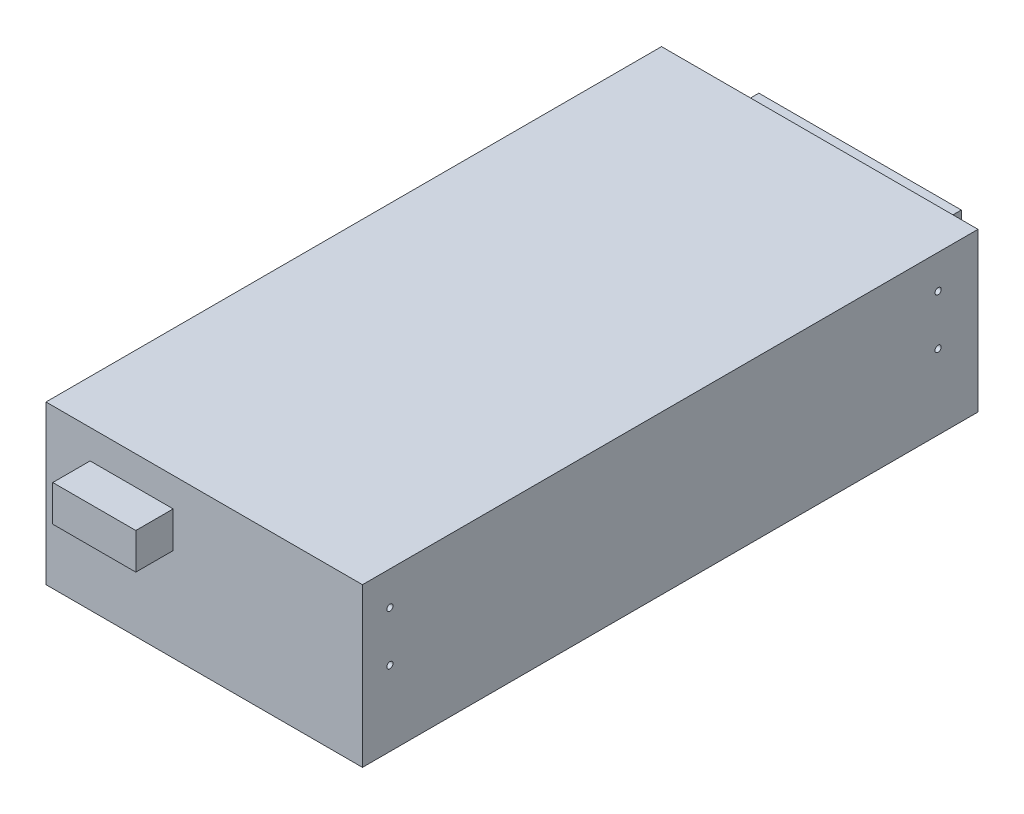
ISO-10303-21;
HEADER;
FILE_DESCRIPTION(('STEP AP214'),'2;1');
FILE_NAME('part.step','',(''),(''),'','','');
FILE_SCHEMA(('AUTOMOTIVE_DESIGN { 1 0 10303 214 1 1 1 1 }'));
ENDSEC;
DATA;
#1=APPLICATION_CONTEXT('core data for automotive mechanical design processes');
#2=APPLICATION_PROTOCOL_DEFINITION('international standard','automotive_design',2000,#1);
#3=PRODUCT_CONTEXT('',#1,'mechanical');
#4=PRODUCT('Part','Part','',(#3));
#5=PRODUCT_RELATED_PRODUCT_CATEGORY('part','',(#4));
#6=PRODUCT_DEFINITION_FORMATION('','',#4);
#7=PRODUCT_DEFINITION_CONTEXT('part definition',#1,'design');
#8=PRODUCT_DEFINITION('design','',#6,#7);
#9=PRODUCT_DEFINITION_SHAPE('','',#8);
#10=(LENGTH_UNIT() NAMED_UNIT(*) SI_UNIT(.MILLI.,.METRE.));
#11=(NAMED_UNIT(*) PLANE_ANGLE_UNIT() SI_UNIT($,.RADIAN.));
#12=(NAMED_UNIT(*) SI_UNIT($,.STERADIAN.) SOLID_ANGLE_UNIT());
#13=UNCERTAINTY_MEASURE_WITH_UNIT(LENGTH_MEASURE(1.E-05),#10,'distance_accuracy_value','');
#14=(GEOMETRIC_REPRESENTATION_CONTEXT(3) GLOBAL_UNCERTAINTY_ASSIGNED_CONTEXT((#13)) GLOBAL_UNIT_ASSIGNED_CONTEXT((#10,
#11,#12)) REPRESENTATION_CONTEXT('',''));
#15=CARTESIAN_POINT('',(0.,0.,0.));
#16=DIRECTION('',(0.,0.,1.));
#17=DIRECTION('',(1.,0.,0.));
#18=AXIS2_PLACEMENT_3D('',#15,#16,#17);
#19=CARTESIAN_POINT('',(-63.5,63.5,-123.5));
#20=DIRECTION('',(0.,0.,1.));
#21=DIRECTION('',(1.,0.,0.));
#22=AXIS2_PLACEMENT_3D('',#19,#20,#21);
#23=PLANE('',#22);
#24=DIRECTION('',(-1.,0.,0.));
#25=VECTOR('',#24,1.);
#26=CARTESIAN_POINT('',(-63.5,0.,-123.5));
#27=LINE('',#26,#25);
#28=CARTESIAN_POINT('',(63.5,0.,-123.5));
#29=VERTEX_POINT('',#28);
#30=CARTESIAN_POINT('',(-63.5,0.,-123.5));
#31=VERTEX_POINT('',#30);
#32=EDGE_CURVE('E288',#29,#31,#27,.T.);
#33=ORIENTED_EDGE('',*,*,#32,.T.);
#34=DIRECTION('',(0.,-1.,0.));
#35=VECTOR('',#34,1.);
#36=CARTESIAN_POINT('',(-63.5,63.5,-123.5));
#37=LINE('',#36,#35);
#38=CARTESIAN_POINT('',(-63.5,63.5,-123.5));
#39=VERTEX_POINT('',#38);
#40=EDGE_CURVE('E54',#39,#31,#37,.T.);
#41=ORIENTED_EDGE('',*,*,#40,.F.);
#42=DIRECTION('',(-1.,0.,0.));
#43=VECTOR('',#42,1.);
#44=CARTESIAN_POINT('',(-63.5,63.5,-123.5));
#45=LINE('',#44,#43);
#46=CARTESIAN_POINT('',(63.5,63.5,-123.5));
#47=VERTEX_POINT('',#46);
#48=EDGE_CURVE('E278',#47,#39,#45,.T.);
#49=ORIENTED_EDGE('',*,*,#48,.F.);
#50=DIRECTION('',(0.,-1.,0.));
#51=VECTOR('',#50,1.);
#52=CARTESIAN_POINT('',(63.5,63.5,-123.5));
#53=LINE('',#52,#51);
#54=EDGE_CURVE('E11',#47,#29,#53,.T.);
#55=ORIENTED_EDGE('',*,*,#54,.T.);
#56=EDGE_LOOP('',(#33,#41,#49,#55));
#57=FACE_BOUND('',#56,.T.);
#58=DIRECTION('',(0.,-1.,0.));
#59=VECTOR('',#58,1.);
#60=CARTESIAN_POINT('',(39.8051658846901,49.8627463500983,-123.5));
#61=LINE('',#60,#59);
#62=CARTESIAN_POINT('',(39.8051658846901,49.8627463500983,-123.5));
#63=VERTEX_POINT('',#62);
#64=CARTESIAN_POINT('',(39.8051658846901,39.7496452615083,-123.5));
#65=VERTEX_POINT('',#64);
#66=EDGE_CURVE('E189',#63,#65,#61,.T.);
#67=ORIENTED_EDGE('',*,*,#66,.F.);
#68=DIRECTION('',(1.,0.,0.));
#69=VECTOR('',#68,1.);
#70=CARTESIAN_POINT('',(39.8051658846901,49.8627463500983,-123.5));
#71=LINE('',#70,#69);
#72=CARTESIAN_POINT('',(-41.4232620588645,49.8627463500983,-123.5));
#73=VERTEX_POINT('',#72);
#74=EDGE_CURVE('E194',#73,#63,#71,.T.);
#75=ORIENTED_EDGE('',*,*,#74,.F.);
#76=DIRECTION('',(0.,1.,0.));
#77=VECTOR('',#76,1.);
#78=CARTESIAN_POINT('',(-41.4232620588645,49.8627463500983,-123.5));
#79=LINE('',#78,#77);
#80=CARTESIAN_POINT('',(-41.4232620588645,39.7496452615083,-123.5));
#81=VERTEX_POINT('',#80);
#82=EDGE_CURVE('E66',#81,#73,#79,.T.);
#83=ORIENTED_EDGE('',*,*,#82,.F.);
#84=DIRECTION('',(-1.,0.,0.));
#85=VECTOR('',#84,1.);
#86=CARTESIAN_POINT('',(39.8051658846901,39.7496452615083,-123.5));
#87=LINE('',#86,#85);
#88=EDGE_CURVE('E61',#65,#81,#87,.T.);
#89=ORIENTED_EDGE('',*,*,#88,.F.);
#90=EDGE_LOOP('',(#67,#75,#83,#89));
#91=FACE_BOUND('',#90,.T.);
#92=ADVANCED_FACE('F46',(#57,#91),#23,.F.);
#93=CARTESIAN_POINT('',(-63.5,63.5,123.5));
#94=DIRECTION('',(0.,0.,-1.));
#95=DIRECTION('',(-1.,0.,0.));
#96=AXIS2_PLACEMENT_3D('',#93,#94,#95);
#97=PLANE('',#96);
#98=DIRECTION('',(1.,0.,0.));
#99=VECTOR('',#98,1.);
#100=CARTESIAN_POINT('',(-63.5,0.,123.5));
#101=LINE('',#100,#99);
#102=CARTESIAN_POINT('',(-63.5,0.,123.5));
#103=VERTEX_POINT('',#102);
#104=CARTESIAN_POINT('',(63.5,0.,123.5));
#105=VERTEX_POINT('',#104);
#106=EDGE_CURVE('E279',#103,#105,#101,.T.);
#107=ORIENTED_EDGE('',*,*,#106,.T.);
#108=DIRECTION('',(0.,-1.,0.));
#109=VECTOR('',#108,1.);
#110=CARTESIAN_POINT('',(63.5,63.5,123.5));
#111=LINE('',#110,#109);
#112=CARTESIAN_POINT('',(63.5,63.5,123.5));
#113=VERTEX_POINT('',#112);
#114=EDGE_CURVE('E285',#113,#105,#111,.T.);
#115=ORIENTED_EDGE('',*,*,#114,.F.);
#116=DIRECTION('',(1.,0.,0.));
#117=VECTOR('',#116,1.);
#118=CARTESIAN_POINT('',(-63.5,63.5,123.5));
#119=LINE('',#118,#117);
#120=CARTESIAN_POINT('',(-63.5,63.5,123.5));
#121=VERTEX_POINT('',#120);
#122=EDGE_CURVE('E283',#121,#113,#119,.T.);
#123=ORIENTED_EDGE('',*,*,#122,.F.);
#124=DIRECTION('',(0.,-1.,0.));
#125=VECTOR('',#124,1.);
#126=CARTESIAN_POINT('',(-63.5,63.5,123.5));
#127=LINE('',#126,#125);
#128=EDGE_CURVE('E297',#121,#103,#127,.T.);
#129=ORIENTED_EDGE('',*,*,#128,.T.);
#130=EDGE_LOOP('',(#107,#115,#123,#129));
#131=FACE_BOUND('',#130,.T.);
#132=DIRECTION('',(0.,-1.,0.));
#133=VECTOR('',#132,1.);
#134=CARTESIAN_POINT('',(-45.7921217291354,51.8620690064516,123.5));
#135=LINE('',#134,#133);
#136=CARTESIAN_POINT('',(-45.7921217291354,51.8620690064516,123.5));
#137=VERTEX_POINT('',#136);
#138=CARTESIAN_POINT('',(-45.7921217291354,37.3801082475908,123.5));
#139=VERTEX_POINT('',#138);
#140=EDGE_CURVE('E217',#137,#139,#135,.T.);
#141=ORIENTED_EDGE('',*,*,#140,.F.);
#142=DIRECTION('',(-1.,0.,0.));
#143=VECTOR('',#142,1.);
#144=CARTESIAN_POINT('',(-45.7921217291354,51.8620690064516,123.5));
#145=LINE('',#144,#143);
#146=CARTESIAN_POINT('',(-12.4593405411429,51.8620690064516,123.5));
#147=VERTEX_POINT('',#146);
#148=EDGE_CURVE('E222',#147,#137,#145,.T.);
#149=ORIENTED_EDGE('',*,*,#148,.F.);
#150=DIRECTION('',(0.,1.,0.));
#151=VECTOR('',#150,1.);
#152=CARTESIAN_POINT('',(-12.4593405411429,51.8620690064516,123.5));
#153=LINE('',#152,#151);
#154=CARTESIAN_POINT('',(-12.4593405411429,37.3801082475908,123.5));
#155=VERTEX_POINT('',#154);
#156=EDGE_CURVE('E234',#155,#147,#153,.T.);
#157=ORIENTED_EDGE('',*,*,#156,.F.);
#158=DIRECTION('',(1.,0.,0.));
#159=VECTOR('',#158,1.);
#160=CARTESIAN_POINT('',(-45.7921217291354,37.3801082475908,123.5));
#161=LINE('',#160,#159);
#162=EDGE_CURVE('E231',#139,#155,#161,.T.);
#163=ORIENTED_EDGE('',*,*,#162,.F.);
#164=EDGE_LOOP('',(#141,#149,#157,#163));
#165=FACE_BOUND('',#164,.T.);
#166=ADVANCED_FACE('F314',(#131,#165),#97,.F.);
#167=CARTESIAN_POINT('',(63.5,63.5,-123.5));
#168=DIRECTION('',(-1.,0.,0.));
#169=DIRECTION('',(0.,0.,1.));
#170=AXIS2_PLACEMENT_3D('',#167,#168,#169);
#171=PLANE('',#170);
#172=CARTESIAN_POINT('',(63.5,50.,112.5));
#173=DIRECTION('',(1.,0.,0.));
#174=DIRECTION('',(0.,0.,-1.));
#175=AXIS2_PLACEMENT_3D('',#172,#173,#174);
#176=CIRCLE('',#175,1.24999999999999);
#177=CARTESIAN_POINT('',(63.5,50.,111.25));
#178=VERTEX_POINT('',#177);
#179=EDGE_CURVE('E250',#178,#178,#176,.T.);
#180=ORIENTED_EDGE('',*,*,#179,.F.);
#181=EDGE_LOOP('',(#180));
#182=FACE_BOUND('',#181,.T.);
#183=CARTESIAN_POINT('',(63.5,30.,-107.5));
#184=DIRECTION('',(1.,0.,0.));
#185=DIRECTION('',(0.,0.,-1.));
#186=AXIS2_PLACEMENT_3D('',#183,#184,#185);
#187=CIRCLE('',#186,1.24999999999999);
#188=CARTESIAN_POINT('',(63.5,30.,-108.75));
#189=VERTEX_POINT('',#188);
#190=EDGE_CURVE('E256',#189,#189,#187,.T.);
#191=ORIENTED_EDGE('',*,*,#190,.F.);
#192=EDGE_LOOP('',(#191));
#193=FACE_BOUND('',#192,.T.);
#194=CARTESIAN_POINT('',(63.5,30.,112.5));
#195=DIRECTION('',(1.,0.,0.));
#196=DIRECTION('',(0.,0.,-1.));
#197=AXIS2_PLACEMENT_3D('',#194,#195,#196);
#198=CIRCLE('',#197,1.24999999999999);
#199=CARTESIAN_POINT('',(63.5,30.,111.25));
#200=VERTEX_POINT('',#199);
#201=EDGE_CURVE('E262',#200,#200,#198,.T.);
#202=ORIENTED_EDGE('',*,*,#201,.F.);
#203=EDGE_LOOP('',(#202));
#204=FACE_BOUND('',#203,.T.);
#205=CARTESIAN_POINT('',(63.5,50.,-107.5));
#206=DIRECTION('',(1.,0.,0.));
#207=DIRECTION('',(0.,0.,-1.));
#208=AXIS2_PLACEMENT_3D('',#205,#206,#207);
#209=CIRCLE('',#208,1.24999999999999);
#210=CARTESIAN_POINT('',(63.5,50.,-108.75));
#211=VERTEX_POINT('',#210);
#212=EDGE_CURVE('E268',#211,#211,#209,.T.);
#213=ORIENTED_EDGE('',*,*,#212,.F.);
#214=EDGE_LOOP('',(#213));
#215=FACE_BOUND('',#214,.T.);
#216=DIRECTION('',(0.,0.,-1.));
#217=VECTOR('',#216,1.);
#218=CARTESIAN_POINT('',(63.5,0.,-123.5));
#219=LINE('',#218,#217);
#220=EDGE_CURVE('E274',#105,#29,#219,.T.);
#221=ORIENTED_EDGE('',*,*,#220,.T.);
#222=ORIENTED_EDGE('',*,*,#54,.F.);
#223=DIRECTION('',(0.,0.,-1.));
#224=VECTOR('',#223,1.);
#225=CARTESIAN_POINT('',(63.5,63.5,-123.5));
#226=LINE('',#225,#224);
#227=EDGE_CURVE('E275',#113,#47,#226,.T.);
#228=ORIENTED_EDGE('',*,*,#227,.F.);
#229=ORIENTED_EDGE('',*,*,#114,.T.);
#230=EDGE_LOOP('',(#221,#222,#228,#229));
#231=FACE_BOUND('',#230,.T.);
#232=ADVANCED_FACE('F48',(#182,#193,#204,#215,#231),#171,.F.);
#233=CARTESIAN_POINT('',(-63.5,63.5,-123.5));
#234=DIRECTION('',(1.,0.,0.));
#235=DIRECTION('',(0.,0.,-1.));
#236=AXIS2_PLACEMENT_3D('',#233,#234,#235);
#237=PLANE('',#236);
#238=CARTESIAN_POINT('',(-63.5,50.,112.5));
#239=DIRECTION('',(-1.,0.,0.));
#240=DIRECTION('',(0.,0.,1.));
#241=AXIS2_PLACEMENT_3D('',#238,#239,#240);
#242=CIRCLE('',#241,1.24999999999999);
#243=CARTESIAN_POINT('',(-63.5,50.,113.75));
#244=VERTEX_POINT('',#243);
#245=EDGE_CURVE('E167',#244,#244,#242,.T.);
#246=ORIENTED_EDGE('',*,*,#245,.F.);
#247=EDGE_LOOP('',(#246));
#248=FACE_BOUND('',#247,.T.);
#249=CARTESIAN_POINT('',(-63.5,30.,-107.5));
#250=DIRECTION('',(-1.,0.,0.));
#251=DIRECTION('',(0.,0.,1.));
#252=AXIS2_PLACEMENT_3D('',#249,#250,#251);
#253=CIRCLE('',#252,1.24999999999999);
#254=CARTESIAN_POINT('',(-63.5,30.,-106.25));
#255=VERTEX_POINT('',#254);
#256=EDGE_CURVE('E166',#255,#255,#253,.T.);
#257=ORIENTED_EDGE('',*,*,#256,.F.);
#258=EDGE_LOOP('',(#257));
#259=FACE_BOUND('',#258,.T.);
#260=CARTESIAN_POINT('',(-63.5,30.,112.5));
#261=DIRECTION('',(-1.,0.,0.));
#262=DIRECTION('',(0.,0.,1.));
#263=AXIS2_PLACEMENT_3D('',#260,#261,#262);
#264=CIRCLE('',#263,1.24999999999999);
#265=CARTESIAN_POINT('',(-63.5,30.,113.75));
#266=VERTEX_POINT('',#265);
#267=EDGE_CURVE('E177',#266,#266,#264,.T.);
#268=ORIENTED_EDGE('',*,*,#267,.F.);
#269=EDGE_LOOP('',(#268));
#270=FACE_BOUND('',#269,.T.);
#271=CARTESIAN_POINT('',(-63.5,50.,-107.5));
#272=DIRECTION('',(-1.,0.,0.));
#273=DIRECTION('',(0.,0.,1.));
#274=AXIS2_PLACEMENT_3D('',#271,#272,#273);
#275=CIRCLE('',#274,1.24999999999999);
#276=CARTESIAN_POINT('',(-63.5,50.,-106.25));
#277=VERTEX_POINT('',#276);
#278=EDGE_CURVE('E183',#277,#277,#275,.T.);
#279=ORIENTED_EDGE('',*,*,#278,.F.);
#280=EDGE_LOOP('',(#279));
#281=FACE_BOUND('',#280,.T.);
#282=DIRECTION('',(0.,0.,1.));
#283=VECTOR('',#282,1.);
#284=CARTESIAN_POINT('',(-63.5,0.,-123.5));
#285=LINE('',#284,#283);
#286=EDGE_CURVE('E291',#31,#103,#285,.T.);
#287=ORIENTED_EDGE('',*,*,#286,.T.);
#288=ORIENTED_EDGE('',*,*,#128,.F.);
#289=DIRECTION('',(0.,0.,1.));
#290=VECTOR('',#289,1.);
#291=CARTESIAN_POINT('',(-63.5,63.5,-123.5));
#292=LINE('',#291,#290);
#293=EDGE_CURVE('E281',#39,#121,#292,.T.);
#294=ORIENTED_EDGE('',*,*,#293,.F.);
#295=ORIENTED_EDGE('',*,*,#40,.T.);
#296=EDGE_LOOP('',(#287,#288,#294,#295));
#297=FACE_BOUND('',#296,.T.);
#298=ADVANCED_FACE('F305',(#248,#259,#270,#281,#297),#237,.F.);
#299=CARTESIAN_POINT('',(0.,63.5,0.));
#300=DIRECTION('',(0.,1.,0.));
#301=DIRECTION('',(0.,0.,1.));
#302=AXIS2_PLACEMENT_3D('',#299,#300,#301);
#303=PLANE('',#302);
#304=ORIENTED_EDGE('',*,*,#227,.T.);
#305=ORIENTED_EDGE('',*,*,#48,.T.);
#306=ORIENTED_EDGE('',*,*,#293,.T.);
#307=ORIENTED_EDGE('',*,*,#122,.T.);
#308=EDGE_LOOP('',(#304,#305,#306,#307));
#309=FACE_BOUND('',#308,.T.);
#310=ADVANCED_FACE('F321',(#309),#303,.T.);
#311=CARTESIAN_POINT('',(0.,0.,0.));
#312=DIRECTION('',(0.,1.,0.));
#313=DIRECTION('',(0.,0.,1.));
#314=AXIS2_PLACEMENT_3D('',#311,#312,#313);
#315=PLANE('',#314);
#316=ORIENTED_EDGE('',*,*,#220,.F.);
#317=ORIENTED_EDGE('',*,*,#106,.F.);
#318=ORIENTED_EDGE('',*,*,#286,.F.);
#319=ORIENTED_EDGE('',*,*,#32,.F.);
#320=EDGE_LOOP('',(#316,#317,#318,#319));
#321=FACE_BOUND('',#320,.T.);
#322=ADVANCED_FACE('F311',(#321),#315,.F.);
#323=CARTESIAN_POINT('',(59.5,50.,-107.5));
#324=DIRECTION('',(1.,0.,0.));
#325=DIRECTION('',(0.,0.,-1.));
#326=AXIS2_PLACEMENT_3D('',#323,#324,#325);
#327=CONICAL_SURFACE('',#326,1.25,1.02974425867666);
#328=CARTESIAN_POINT('',(58.7489242262155,50.,-107.5));
#329=VERTEX_POINT('',#328);
#330=VERTEX_LOOP('',#329);
#331=FACE_BOUND('',#330,.T.);
#332=CARTESIAN_POINT('',(59.5,50.,-107.5));
#333=DIRECTION('',(1.,0.,0.));
#334=DIRECTION('',(0.,0.,-1.));
#335=AXIS2_PLACEMENT_3D('',#332,#333,#334);
#336=CIRCLE('',#335,1.25);
#337=CARTESIAN_POINT('',(59.5,50.,-108.75));
#338=VERTEX_POINT('',#337);
#339=EDGE_CURVE('E271',#338,#338,#336,.T.);
#340=ORIENTED_EDGE('',*,*,#339,.T.);
#341=EDGE_LOOP('',(#340));
#342=FACE_BOUND('',#341,.T.);
#343=ADVANCED_FACE('F397',(#331,#342),#327,.F.);
#344=CARTESIAN_POINT('',(63.5,50.,-107.5));
#345=DIRECTION('',(1.,0.,0.));
#346=DIRECTION('',(0.,0.,-1.));
#347=AXIS2_PLACEMENT_3D('',#344,#345,#346);
#348=CYLINDRICAL_SURFACE('',#347,1.24999999999999);
#349=ORIENTED_EDGE('',*,*,#339,.F.);
#350=EDGE_LOOP('',(#349));
#351=FACE_BOUND('',#350,.T.);
#352=ORIENTED_EDGE('',*,*,#212,.T.);
#353=EDGE_LOOP('',(#352));
#354=FACE_BOUND('',#353,.T.);
#355=ADVANCED_FACE('F393',(#351,#354),#348,.F.);
#356=CARTESIAN_POINT('',(59.5,30.,112.5));
#357=DIRECTION('',(1.,0.,0.));
#358=DIRECTION('',(0.,0.,-1.));
#359=AXIS2_PLACEMENT_3D('',#356,#357,#358);
#360=CONICAL_SURFACE('',#359,1.25,1.02974425867666);
#361=CARTESIAN_POINT('',(58.7489242262156,30.,112.5));
#362=VERTEX_POINT('',#361);
#363=VERTEX_LOOP('',#362);
#364=FACE_BOUND('',#363,.T.);
#365=CARTESIAN_POINT('',(59.5,30.,112.5));
#366=DIRECTION('',(1.,0.,0.));
#367=DIRECTION('',(0.,0.,-1.));
#368=AXIS2_PLACEMENT_3D('',#365,#366,#367);
#369=CIRCLE('',#368,1.25);
#370=CARTESIAN_POINT('',(59.5,30.,111.25));
#371=VERTEX_POINT('',#370);
#372=EDGE_CURVE('E265',#371,#371,#369,.T.);
#373=ORIENTED_EDGE('',*,*,#372,.T.);
#374=EDGE_LOOP('',(#373));
#375=FACE_BOUND('',#374,.T.);
#376=ADVANCED_FACE('F389',(#364,#375),#360,.F.);
#377=CARTESIAN_POINT('',(63.5,30.,112.5));
#378=DIRECTION('',(1.,0.,0.));
#379=DIRECTION('',(0.,0.,-1.));
#380=AXIS2_PLACEMENT_3D('',#377,#378,#379);
#381=CYLINDRICAL_SURFACE('',#380,1.24999999999999);
#382=ORIENTED_EDGE('',*,*,#372,.F.);
#383=EDGE_LOOP('',(#382));
#384=FACE_BOUND('',#383,.T.);
#385=ORIENTED_EDGE('',*,*,#201,.T.);
#386=EDGE_LOOP('',(#385));
#387=FACE_BOUND('',#386,.T.);
#388=ADVANCED_FACE('F385',(#384,#387),#381,.F.);
#389=CARTESIAN_POINT('',(59.5,30.,-107.5));
#390=DIRECTION('',(1.,0.,0.));
#391=DIRECTION('',(0.,0.,-1.));
#392=AXIS2_PLACEMENT_3D('',#389,#390,#391);
#393=CONICAL_SURFACE('',#392,1.25,1.02974425867666);
#394=CARTESIAN_POINT('',(58.7489242262155,30.,-107.5));
#395=VERTEX_POINT('',#394);
#396=VERTEX_LOOP('',#395);
#397=FACE_BOUND('',#396,.T.);
#398=CARTESIAN_POINT('',(59.5,30.,-107.5));
#399=DIRECTION('',(1.,0.,0.));
#400=DIRECTION('',(0.,0.,-1.));
#401=AXIS2_PLACEMENT_3D('',#398,#399,#400);
#402=CIRCLE('',#401,1.25);
#403=CARTESIAN_POINT('',(59.5,30.,-108.75));
#404=VERTEX_POINT('',#403);
#405=EDGE_CURVE('E259',#404,#404,#402,.T.);
#406=ORIENTED_EDGE('',*,*,#405,.T.);
#407=EDGE_LOOP('',(#406));
#408=FACE_BOUND('',#407,.T.);
#409=ADVANCED_FACE('F381',(#397,#408),#393,.F.);
#410=CARTESIAN_POINT('',(63.5,30.,-107.5));
#411=DIRECTION('',(1.,0.,0.));
#412=DIRECTION('',(0.,0.,-1.));
#413=AXIS2_PLACEMENT_3D('',#410,#411,#412);
#414=CYLINDRICAL_SURFACE('',#413,1.24999999999999);
#415=ORIENTED_EDGE('',*,*,#405,.F.);
#416=EDGE_LOOP('',(#415));
#417=FACE_BOUND('',#416,.T.);
#418=ORIENTED_EDGE('',*,*,#190,.T.);
#419=EDGE_LOOP('',(#418));
#420=FACE_BOUND('',#419,.T.);
#421=ADVANCED_FACE('F377',(#417,#420),#414,.F.);
#422=CARTESIAN_POINT('',(59.5,50.,112.5));
#423=DIRECTION('',(1.,0.,0.));
#424=DIRECTION('',(0.,0.,-1.));
#425=AXIS2_PLACEMENT_3D('',#422,#423,#424);
#426=CONICAL_SURFACE('',#425,1.25,1.02974425867666);
#427=CARTESIAN_POINT('',(58.7489242262156,50.,112.5));
#428=VERTEX_POINT('',#427);
#429=VERTEX_LOOP('',#428);
#430=FACE_BOUND('',#429,.T.);
#431=CARTESIAN_POINT('',(59.5,50.,112.5));
#432=DIRECTION('',(1.,0.,0.));
#433=DIRECTION('',(0.,0.,-1.));
#434=AXIS2_PLACEMENT_3D('',#431,#432,#433);
#435=CIRCLE('',#434,1.25);
#436=CARTESIAN_POINT('',(59.5,50.,111.25));
#437=VERTEX_POINT('',#436);
#438=EDGE_CURVE('E253',#437,#437,#435,.T.);
#439=ORIENTED_EDGE('',*,*,#438,.T.);
#440=EDGE_LOOP('',(#439));
#441=FACE_BOUND('',#440,.T.);
#442=ADVANCED_FACE('F373',(#430,#441),#426,.F.);
#443=CARTESIAN_POINT('',(63.5,50.,112.5));
#444=DIRECTION('',(1.,0.,0.));
#445=DIRECTION('',(0.,0.,-1.));
#446=AXIS2_PLACEMENT_3D('',#443,#444,#445);
#447=CYLINDRICAL_SURFACE('',#446,1.24999999999999);
#448=ORIENTED_EDGE('',*,*,#438,.F.);
#449=EDGE_LOOP('',(#448));
#450=FACE_BOUND('',#449,.T.);
#451=ORIENTED_EDGE('',*,*,#179,.T.);
#452=EDGE_LOOP('',(#451));
#453=FACE_BOUND('',#452,.T.);
#454=ADVANCED_FACE('F369',(#450,#453),#447,.F.);
#455=CARTESIAN_POINT('',(-45.7921217291354,51.8620690064516,138.5));
#456=DIRECTION('',(1.,0.,0.));
#457=DIRECTION('',(0.,0.,-1.));
#458=AXIS2_PLACEMENT_3D('',#455,#456,#457);
#459=PLANE('',#458);
#460=ORIENTED_EDGE('',*,*,#140,.T.);
#461=DIRECTION('',(0.,0.,-1.));
#462=VECTOR('',#461,1.);
#463=CARTESIAN_POINT('',(-45.7921217291354,37.3801082475908,138.5));
#464=LINE('',#463,#462);
#465=CARTESIAN_POINT('',(-45.7921217291354,37.3801082475908,138.5));
#466=VERTEX_POINT('',#465);
#467=EDGE_CURVE('E247',#466,#139,#464,.T.);
#468=ORIENTED_EDGE('',*,*,#467,.F.);
#469=DIRECTION('',(0.,-1.,0.));
#470=VECTOR('',#469,1.);
#471=CARTESIAN_POINT('',(-45.7921217291354,51.8620690064516,138.5));
#472=LINE('',#471,#470);
#473=CARTESIAN_POINT('',(-45.7921217291354,51.8620690064516,138.5));
#474=VERTEX_POINT('',#473);
#475=EDGE_CURVE('E218',#474,#466,#472,.T.);
#476=ORIENTED_EDGE('',*,*,#475,.F.);
#477=DIRECTION('',(0.,0.,-1.));
#478=VECTOR('',#477,1.);
#479=CARTESIAN_POINT('',(-45.7921217291354,51.8620690064516,138.5));
#480=LINE('',#479,#478);
#481=EDGE_CURVE('E228',#474,#137,#480,.T.);
#482=ORIENTED_EDGE('',*,*,#481,.T.);
#483=EDGE_LOOP('',(#460,#468,#476,#482));
#484=FACE_BOUND('',#483,.T.);
#485=ADVANCED_FACE('F365',(#484),#459,.F.);
#486=CARTESIAN_POINT('',(-45.7921217291354,37.3801082475908,138.5));
#487=DIRECTION('',(0.,1.,0.));
#488=DIRECTION('',(0.,0.,1.));
#489=AXIS2_PLACEMENT_3D('',#486,#487,#488);
#490=PLANE('',#489);
#491=ORIENTED_EDGE('',*,*,#162,.T.);
#492=DIRECTION('',(0.,0.,-1.));
#493=VECTOR('',#492,1.);
#494=CARTESIAN_POINT('',(-12.4593405411429,37.3801082475908,138.5));
#495=LINE('',#494,#493);
#496=CARTESIAN_POINT('',(-12.4593405411429,37.3801082475908,138.5));
#497=VERTEX_POINT('',#496);
#498=EDGE_CURVE('E244',#497,#155,#495,.T.);
#499=ORIENTED_EDGE('',*,*,#498,.F.);
#500=DIRECTION('',(1.,0.,0.));
#501=VECTOR('',#500,1.);
#502=CARTESIAN_POINT('',(-45.7921217291354,37.3801082475908,138.5));
#503=LINE('',#502,#501);
#504=EDGE_CURVE('E221',#466,#497,#503,.T.);
#505=ORIENTED_EDGE('',*,*,#504,.F.);
#506=ORIENTED_EDGE('',*,*,#467,.T.);
#507=EDGE_LOOP('',(#491,#499,#505,#506));
#508=FACE_BOUND('',#507,.T.);
#509=ADVANCED_FACE('F361',(#508),#490,.F.);
#510=CARTESIAN_POINT('',(-12.4593405411429,51.8620690064516,138.5));
#511=DIRECTION('',(-1.,0.,0.));
#512=DIRECTION('',(0.,0.,1.));
#513=AXIS2_PLACEMENT_3D('',#510,#511,#512);
#514=PLANE('',#513);
#515=ORIENTED_EDGE('',*,*,#156,.T.);
#516=DIRECTION('',(0.,0.,-1.));
#517=VECTOR('',#516,1.);
#518=CARTESIAN_POINT('',(-12.4593405411429,51.8620690064516,138.5));
#519=LINE('',#518,#517);
#520=CARTESIAN_POINT('',(-12.4593405411429,51.8620690064516,138.5));
#521=VERTEX_POINT('',#520);
#522=EDGE_CURVE('E241',#521,#147,#519,.T.);
#523=ORIENTED_EDGE('',*,*,#522,.F.);
#524=DIRECTION('',(0.,1.,0.));
#525=VECTOR('',#524,1.);
#526=CARTESIAN_POINT('',(-12.4593405411429,51.8620690064516,138.5));
#527=LINE('',#526,#525);
#528=EDGE_CURVE('E224',#497,#521,#527,.T.);
#529=ORIENTED_EDGE('',*,*,#528,.F.);
#530=ORIENTED_EDGE('',*,*,#498,.T.);
#531=EDGE_LOOP('',(#515,#523,#529,#530));
#532=FACE_BOUND('',#531,.T.);
#533=ADVANCED_FACE('F357',(#532),#514,.F.);
#534=CARTESIAN_POINT('',(-45.7921217291354,51.8620690064516,138.5));
#535=DIRECTION('',(0.,-1.,0.));
#536=DIRECTION('',(0.,0.,-1.));
#537=AXIS2_PLACEMENT_3D('',#534,#535,#536);
#538=PLANE('',#537);
#539=ORIENTED_EDGE('',*,*,#148,.T.);
#540=ORIENTED_EDGE('',*,*,#481,.F.);
#541=DIRECTION('',(-1.,0.,0.));
#542=VECTOR('',#541,1.);
#543=CARTESIAN_POINT('',(-45.7921217291354,51.8620690064516,138.5));
#544=LINE('',#543,#542);
#545=EDGE_CURVE('E226',#521,#474,#544,.T.);
#546=ORIENTED_EDGE('',*,*,#545,.F.);
#547=ORIENTED_EDGE('',*,*,#522,.T.);
#548=EDGE_LOOP('',(#539,#540,#546,#547));
#549=FACE_BOUND('',#548,.T.);
#550=ADVANCED_FACE('F353',(#549),#538,.F.);
#551=CARTESIAN_POINT('',(0.,0.,138.5));
#552=DIRECTION('',(0.,0.,1.));
#553=DIRECTION('',(1.,0.,0.));
#554=AXIS2_PLACEMENT_3D('',#551,#552,#553);
#555=PLANE('',#554);
#556=ORIENTED_EDGE('',*,*,#475,.T.);
#557=ORIENTED_EDGE('',*,*,#504,.T.);
#558=ORIENTED_EDGE('',*,*,#528,.T.);
#559=ORIENTED_EDGE('',*,*,#545,.T.);
#560=EDGE_LOOP('',(#556,#557,#558,#559));
#561=FACE_BOUND('',#560,.T.);
#562=ADVANCED_FACE('F347',(#561),#555,.T.);
#563=CARTESIAN_POINT('',(39.8051658846901,49.8627463500983,-140.5));
#564=DIRECTION('',(-1.,0.,0.));
#565=DIRECTION('',(0.,0.,1.));
#566=AXIS2_PLACEMENT_3D('',#563,#564,#565);
#567=PLANE('',#566);
#568=ORIENTED_EDGE('',*,*,#66,.T.);
#569=DIRECTION('',(0.,0.,1.));
#570=VECTOR('',#569,1.);
#571=CARTESIAN_POINT('',(39.8051658846901,39.7496452615083,-140.5));
#572=LINE('',#571,#570);
#573=CARTESIAN_POINT('',(39.8051658846901,39.7496452615083,-140.5));
#574=VERTEX_POINT('',#573);
#575=EDGE_CURVE('E215',#574,#65,#572,.T.);
#576=ORIENTED_EDGE('',*,*,#575,.F.);
#577=DIRECTION('',(0.,-1.,0.));
#578=VECTOR('',#577,1.);
#579=CARTESIAN_POINT('',(39.8051658846901,49.8627463500983,-140.5));
#580=LINE('',#579,#578);
#581=CARTESIAN_POINT('',(39.8051658846901,49.8627463500983,-140.5));
#582=VERTEX_POINT('',#581);
#583=EDGE_CURVE('E190',#582,#574,#580,.T.);
#584=ORIENTED_EDGE('',*,*,#583,.F.);
#585=DIRECTION('',(0.,0.,1.));
#586=VECTOR('',#585,1.);
#587=CARTESIAN_POINT('',(39.8051658846901,49.8627463500983,-140.5));
#588=LINE('',#587,#586);
#589=EDGE_CURVE('E200',#582,#63,#588,.T.);
#590=ORIENTED_EDGE('',*,*,#589,.T.);
#591=EDGE_LOOP('',(#568,#576,#584,#590));
#592=FACE_BOUND('',#591,.T.);
#593=ADVANCED_FACE('F331',(#592),#567,.F.);
#594=CARTESIAN_POINT('',(39.8051658846901,39.7496452615083,-140.5));
#595=DIRECTION('',(0.,1.,0.));
#596=DIRECTION('',(0.,0.,1.));
#597=AXIS2_PLACEMENT_3D('',#594,#595,#596);
#598=PLANE('',#597);
#599=ORIENTED_EDGE('',*,*,#88,.T.);
#600=DIRECTION('',(0.,0.,1.));
#601=VECTOR('',#600,1.);
#602=CARTESIAN_POINT('',(-41.4232620588645,39.7496452615083,-140.5));
#603=LINE('',#602,#601);
#604=CARTESIAN_POINT('',(-41.4232620588645,39.7496452615083,-140.5));
#605=VERTEX_POINT('',#604);
#606=EDGE_CURVE('E212',#605,#81,#603,.T.);
#607=ORIENTED_EDGE('',*,*,#606,.F.);
#608=DIRECTION('',(-1.,0.,0.));
#609=VECTOR('',#608,1.);
#610=CARTESIAN_POINT('',(39.8051658846901,39.7496452615083,-140.5));
#611=LINE('',#610,#609);
#612=EDGE_CURVE('E193',#574,#605,#611,.T.);
#613=ORIENTED_EDGE('',*,*,#612,.F.);
#614=ORIENTED_EDGE('',*,*,#575,.T.);
#615=EDGE_LOOP('',(#599,#607,#613,#614));
#616=FACE_BOUND('',#615,.T.);
#617=ADVANCED_FACE('F339',(#616),#598,.F.);
#618=CARTESIAN_POINT('',(-41.4232620588645,49.8627463500983,-140.5));
#619=DIRECTION('',(1.,0.,0.));
#620=DIRECTION('',(0.,0.,-1.));
#621=AXIS2_PLACEMENT_3D('',#618,#619,#620);
#622=PLANE('',#621);
#623=ORIENTED_EDGE('',*,*,#82,.T.);
#624=DIRECTION('',(0.,0.,1.));
#625=VECTOR('',#624,1.);
#626=CARTESIAN_POINT('',(-41.4232620588645,49.8627463500983,-140.5));
#627=LINE('',#626,#625);
#628=CARTESIAN_POINT('',(-41.4232620588645,49.8627463500983,-140.5));
#629=VERTEX_POINT('',#628);
#630=EDGE_CURVE('E209',#629,#73,#627,.T.);
#631=ORIENTED_EDGE('',*,*,#630,.F.);
#632=DIRECTION('',(0.,1.,0.));
#633=VECTOR('',#632,1.);
#634=CARTESIAN_POINT('',(-41.4232620588645,49.8627463500983,-140.5));
#635=LINE('',#634,#633);
#636=EDGE_CURVE('E196',#605,#629,#635,.T.);
#637=ORIENTED_EDGE('',*,*,#636,.F.);
#638=ORIENTED_EDGE('',*,*,#606,.T.);
#639=EDGE_LOOP('',(#623,#631,#637,#638));
#640=FACE_BOUND('',#639,.T.);
#641=ADVANCED_FACE('F337',(#640),#622,.F.);
#642=CARTESIAN_POINT('',(39.8051658846901,49.8627463500983,-140.5));
#643=DIRECTION('',(0.,-1.,0.));
#644=DIRECTION('',(0.,0.,-1.));
#645=AXIS2_PLACEMENT_3D('',#642,#643,#644);
#646=PLANE('',#645);
#647=ORIENTED_EDGE('',*,*,#74,.T.);
#648=ORIENTED_EDGE('',*,*,#589,.F.);
#649=DIRECTION('',(1.,0.,0.));
#650=VECTOR('',#649,1.);
#651=CARTESIAN_POINT('',(39.8051658846901,49.8627463500983,-140.5));
#652=LINE('',#651,#650);
#653=EDGE_CURVE('E198',#629,#582,#652,.T.);
#654=ORIENTED_EDGE('',*,*,#653,.F.);
#655=ORIENTED_EDGE('',*,*,#630,.T.);
#656=EDGE_LOOP('',(#647,#648,#654,#655));
#657=FACE_BOUND('',#656,.T.);
#658=ADVANCED_FACE('F327',(#657),#646,.F.);
#659=CARTESIAN_POINT('',(0.,0.,-140.5));
#660=DIRECTION('',(0.,0.,-1.));
#661=DIRECTION('',(-1.,0.,0.));
#662=AXIS2_PLACEMENT_3D('',#659,#660,#661);
#663=PLANE('',#662);
#664=ORIENTED_EDGE('',*,*,#583,.T.);
#665=ORIENTED_EDGE('',*,*,#612,.T.);
#666=ORIENTED_EDGE('',*,*,#636,.T.);
#667=ORIENTED_EDGE('',*,*,#653,.T.);
#668=EDGE_LOOP('',(#664,#665,#666,#667));
#669=FACE_BOUND('',#668,.T.);
#670=ADVANCED_FACE('F333',(#669),#663,.T.);
#671=CARTESIAN_POINT('',(-59.5,50.,-107.5));
#672=DIRECTION('',(-1.,0.,0.));
#673=DIRECTION('',(0.,0.,1.));
#674=AXIS2_PLACEMENT_3D('',#671,#672,#673);
#675=CONICAL_SURFACE('',#674,1.25,1.02974425867666);
#676=CARTESIAN_POINT('',(-58.7489242262155,50.,-107.5));
#677=VERTEX_POINT('',#676);
#678=VERTEX_LOOP('',#677);
#679=FACE_BOUND('',#678,.T.);
#680=CARTESIAN_POINT('',(-59.5,50.,-107.5));
#681=DIRECTION('',(-1.,0.,0.));
#682=DIRECTION('',(0.,0.,1.));
#683=AXIS2_PLACEMENT_3D('',#680,#681,#682);
#684=CIRCLE('',#683,1.25);
#685=CARTESIAN_POINT('',(-59.5,50.,-106.25));
#686=VERTEX_POINT('',#685);
#687=EDGE_CURVE('E186',#686,#686,#684,.T.);
#688=ORIENTED_EDGE('',*,*,#687,.T.);
#689=EDGE_LOOP('',(#688));
#690=FACE_BOUND('',#689,.T.);
#691=ADVANCED_FACE('F425',(#679,#690),#675,.F.);
#692=CARTESIAN_POINT('',(-63.5,50.,-107.5));
#693=DIRECTION('',(-1.,0.,0.));
#694=DIRECTION('',(0.,0.,1.));
#695=AXIS2_PLACEMENT_3D('',#692,#693,#694);
#696=CYLINDRICAL_SURFACE('',#695,1.24999999999999);
#697=ORIENTED_EDGE('',*,*,#687,.F.);
#698=EDGE_LOOP('',(#697));
#699=FACE_BOUND('',#698,.T.);
#700=ORIENTED_EDGE('',*,*,#278,.T.);
#701=EDGE_LOOP('',(#700));
#702=FACE_BOUND('',#701,.T.);
#703=ADVANCED_FACE('F422',(#699,#702),#696,.F.);
#704=CARTESIAN_POINT('',(-59.5,30.,112.5));
#705=DIRECTION('',(-1.,0.,0.));
#706=DIRECTION('',(0.,0.,1.));
#707=AXIS2_PLACEMENT_3D('',#704,#705,#706);
#708=CONICAL_SURFACE('',#707,1.25,1.02974425867666);
#709=CARTESIAN_POINT('',(-58.7489242262156,30.,112.5));
#710=VERTEX_POINT('',#709);
#711=VERTEX_LOOP('',#710);
#712=FACE_BOUND('',#711,.T.);
#713=CARTESIAN_POINT('',(-59.5,30.,112.5));
#714=DIRECTION('',(-1.,0.,0.));
#715=DIRECTION('',(0.,0.,1.));
#716=AXIS2_PLACEMENT_3D('',#713,#714,#715);
#717=CIRCLE('',#716,1.25);
#718=CARTESIAN_POINT('',(-59.5,30.,113.75));
#719=VERTEX_POINT('',#718);
#720=EDGE_CURVE('E180',#719,#719,#717,.T.);
#721=ORIENTED_EDGE('',*,*,#720,.T.);
#722=EDGE_LOOP('',(#721));
#723=FACE_BOUND('',#722,.T.);
#724=ADVANCED_FACE('F424',(#712,#723),#708,.F.);
#725=CARTESIAN_POINT('',(-63.5,30.,112.5));
#726=DIRECTION('',(-1.,0.,0.));
#727=DIRECTION('',(0.,0.,1.));
#728=AXIS2_PLACEMENT_3D('',#725,#726,#727);
#729=CYLINDRICAL_SURFACE('',#728,1.24999999999999);
#730=ORIENTED_EDGE('',*,*,#720,.F.);
#731=EDGE_LOOP('',(#730));
#732=FACE_BOUND('',#731,.T.);
#733=ORIENTED_EDGE('',*,*,#267,.T.);
#734=EDGE_LOOP('',(#733));
#735=FACE_BOUND('',#734,.T.);
#736=ADVANCED_FACE('F432',(#732,#735),#729,.F.);
#737=CARTESIAN_POINT('',(-59.5,30.,-107.5));
#738=DIRECTION('',(-1.,0.,0.));
#739=DIRECTION('',(0.,0.,1.));
#740=AXIS2_PLACEMENT_3D('',#737,#738,#739);
#741=CONICAL_SURFACE('',#740,1.25,1.02974425867666);
#742=CARTESIAN_POINT('',(-58.7489242262155,30.,-107.5));
#743=VERTEX_POINT('',#742);
#744=VERTEX_LOOP('',#743);
#745=FACE_BOUND('',#744,.T.);
#746=CARTESIAN_POINT('',(-59.5,30.,-107.5));
#747=DIRECTION('',(-1.,0.,0.));
#748=DIRECTION('',(0.,0.,1.));
#749=AXIS2_PLACEMENT_3D('',#746,#747,#748);
#750=CIRCLE('',#749,1.25);
#751=CARTESIAN_POINT('',(-59.5,30.,-106.25));
#752=VERTEX_POINT('',#751);
#753=EDGE_CURVE('E170',#752,#752,#750,.T.);
#754=ORIENTED_EDGE('',*,*,#753,.T.);
#755=EDGE_LOOP('',(#754));
#756=FACE_BOUND('',#755,.T.);
#757=ADVANCED_FACE('F483',(#745,#756),#741,.F.);
#758=CARTESIAN_POINT('',(-63.5,30.,-107.5));
#759=DIRECTION('',(-1.,0.,0.));
#760=DIRECTION('',(0.,0.,1.));
#761=AXIS2_PLACEMENT_3D('',#758,#759,#760);
#762=CYLINDRICAL_SURFACE('',#761,1.24999999999999);
#763=ORIENTED_EDGE('',*,*,#753,.F.);
#764=EDGE_LOOP('',(#763));
#765=FACE_BOUND('',#764,.T.);
#766=ORIENTED_EDGE('',*,*,#256,.T.);
#767=EDGE_LOOP('',(#766));
#768=FACE_BOUND('',#767,.T.);
#769=ADVANCED_FACE('F160',(#765,#768),#762,.F.);
#770=CARTESIAN_POINT('',(-59.5,50.,112.5));
#771=DIRECTION('',(-1.,0.,0.));
#772=DIRECTION('',(0.,0.,1.));
#773=AXIS2_PLACEMENT_3D('',#770,#771,#772);
#774=CONICAL_SURFACE('',#773,1.25,1.02974425867666);
#775=CARTESIAN_POINT('',(-58.7489242262156,50.,112.5));
#776=VERTEX_POINT('',#775);
#777=VERTEX_LOOP('',#776);
#778=FACE_BOUND('',#777,.T.);
#779=CARTESIAN_POINT('',(-59.5,50.,112.5));
#780=DIRECTION('',(-1.,0.,0.));
#781=DIRECTION('',(0.,0.,1.));
#782=AXIS2_PLACEMENT_3D('',#779,#780,#781);
#783=CIRCLE('',#782,1.25);
#784=CARTESIAN_POINT('',(-59.5,50.,113.75));
#785=VERTEX_POINT('',#784);
#786=EDGE_CURVE('E164',#785,#785,#783,.T.);
#787=ORIENTED_EDGE('',*,*,#786,.T.);
#788=EDGE_LOOP('',(#787));
#789=FACE_BOUND('',#788,.T.);
#790=ADVANCED_FACE('F156',(#778,#789),#774,.F.);
#791=CARTESIAN_POINT('',(-63.5,50.,112.5));
#792=DIRECTION('',(-1.,0.,0.));
#793=DIRECTION('',(0.,0.,1.));
#794=AXIS2_PLACEMENT_3D('',#791,#792,#793);
#795=CYLINDRICAL_SURFACE('',#794,1.24999999999999);
#796=ORIENTED_EDGE('',*,*,#786,.F.);
#797=EDGE_LOOP('',(#796));
#798=FACE_BOUND('',#797,.T.);
#799=ORIENTED_EDGE('',*,*,#245,.T.);
#800=EDGE_LOOP('',(#799));
#801=FACE_BOUND('',#800,.T.);
#802=ADVANCED_FACE('F159',(#798,#801),#795,.F.);
#803=CLOSED_SHELL('',(#92,#166,#232,#298,#310,#322,#343,#355,#376,#388,#409,#421,#442,#454,#485,
#509,#533,#550,#562,#593,#617,#641,#658,#670,#691,#703,#724,#736,#757,#769,#790,#802));
#804=MANIFOLD_SOLID_BREP('B2',#803);
#805=ADVANCED_BREP_SHAPE_REPRESENTATION('',(#18,#804),#14);
#806=SHAPE_DEFINITION_REPRESENTATION(#9,#805);
ENDSEC;
END-ISO-10303-21;
